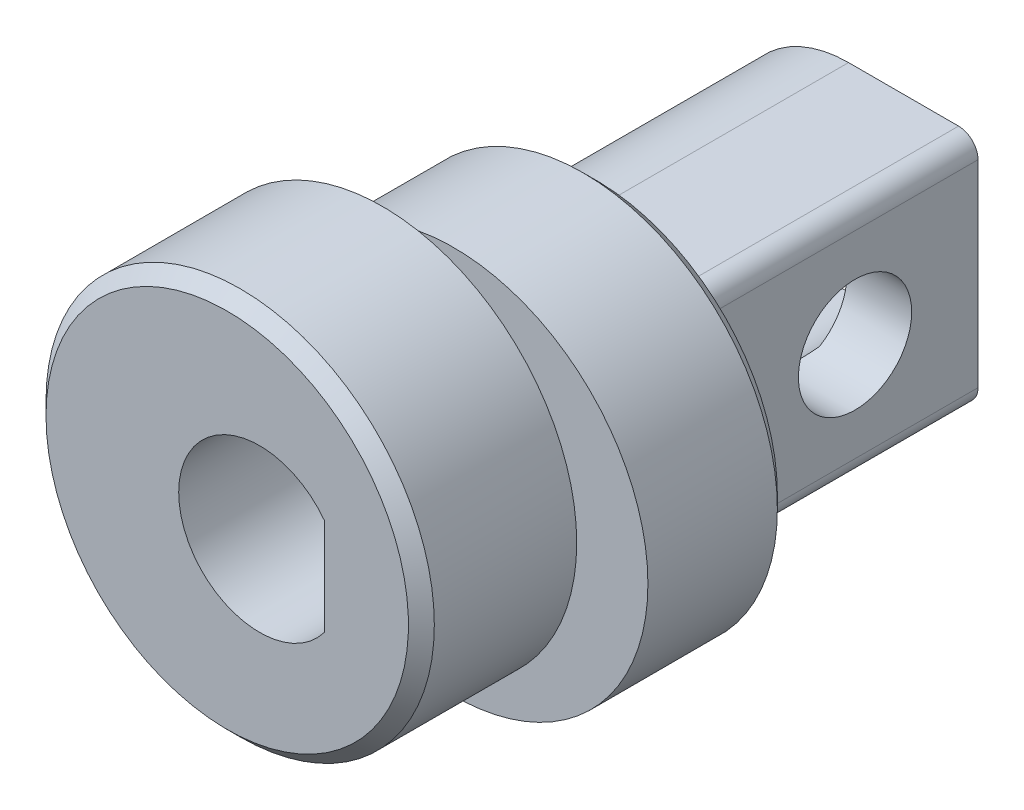
ISO-10303-21;
HEADER;
FILE_DESCRIPTION(('STEP AP214'),'2;1');
FILE_NAME('part.step','',(''),(''),'','','');
FILE_SCHEMA(('AUTOMOTIVE_DESIGN { 1 0 10303 214 1 1 1 1 }'));
ENDSEC;
DATA;
#1=APPLICATION_CONTEXT('core data for automotive mechanical design processes');
#2=APPLICATION_PROTOCOL_DEFINITION('international standard','automotive_design',2000,#1);
#3=PRODUCT_CONTEXT('',#1,'mechanical');
#4=PRODUCT('Part','Part','',(#3));
#5=PRODUCT_RELATED_PRODUCT_CATEGORY('part','',(#4));
#6=PRODUCT_DEFINITION_FORMATION('','',#4);
#7=PRODUCT_DEFINITION_CONTEXT('part definition',#1,'design');
#8=PRODUCT_DEFINITION('design','',#6,#7);
#9=PRODUCT_DEFINITION_SHAPE('','',#8);
#10=(LENGTH_UNIT() NAMED_UNIT(*) SI_UNIT(.MILLI.,.METRE.));
#11=(NAMED_UNIT(*) PLANE_ANGLE_UNIT() SI_UNIT($,.RADIAN.));
#12=(NAMED_UNIT(*) SI_UNIT($,.STERADIAN.) SOLID_ANGLE_UNIT());
#13=UNCERTAINTY_MEASURE_WITH_UNIT(LENGTH_MEASURE(1.E-05),#10,'distance_accuracy_value','');
#14=(GEOMETRIC_REPRESENTATION_CONTEXT(3) GLOBAL_UNCERTAINTY_ASSIGNED_CONTEXT((#13)) GLOBAL_UNIT_ASSIGNED_CONTEXT((#10,
#11,#12)) REPRESENTATION_CONTEXT('',''));
#15=CARTESIAN_POINT('',(0.,0.,0.));
#16=DIRECTION('',(0.,0.,1.));
#17=DIRECTION('',(1.,0.,0.));
#18=AXIS2_PLACEMENT_3D('',#15,#16,#17);
#19=CARTESIAN_POINT('',(2.,-1.5,-8.79999999993873));
#20=DIRECTION('',(1.,0.,0.));
#21=DIRECTION('',(0.,0.,-1.));
#22=AXIS2_PLACEMENT_3D('',#19,#20,#21);
#23=PLANE('',#22);
#24=DIRECTION('',(0.,0.,1.));
#25=VECTOR('',#24,1.);
#26=CARTESIAN_POINT('',(2.,1.5,-8.79999999993873));
#27=LINE('',#26,#25);
#28=CARTESIAN_POINT('',(2.,1.5,-4.09861218113402));
#29=VERTEX_POINT('',#28);
#30=CARTESIAN_POINT('',(2.,1.5,9.4));
#31=VERTEX_POINT('',#30);
#32=EDGE_CURVE('E146',#29,#31,#27,.T.);
#33=ORIENTED_EDGE('',*,*,#32,.F.);
#34=CARTESIAN_POINT('',(2.,0.,-5.));
#35=DIRECTION('',(1.,0.,0.));
#36=DIRECTION('',(0.,0.,-1.));
#37=AXIS2_PLACEMENT_3D('',#34,#35,#36);
#38=CIRCLE('',#37,1.74999999999999);
#39=CARTESIAN_POINT('',(2.,-1.5,-4.09861218113402));
#40=VERTEX_POINT('',#39);
#41=EDGE_CURVE('E59',#29,#40,#38,.T.);
#42=ORIENTED_EDGE('',*,*,#41,.T.);
#43=DIRECTION('',(0.,0.,1.));
#44=VECTOR('',#43,1.);
#45=CARTESIAN_POINT('',(2.,-1.5,-8.79999999993873));
#46=LINE('',#45,#44);
#47=CARTESIAN_POINT('',(2.,-1.5,9.4));
#48=VERTEX_POINT('',#47);
#49=EDGE_CURVE('E154',#40,#48,#46,.T.);
#50=ORIENTED_EDGE('',*,*,#49,.T.);
#51=DIRECTION('',(0.,1.,0.));
#52=VECTOR('',#51,1.);
#53=CARTESIAN_POINT('',(2.,-1.5,9.4));
#54=LINE('',#53,#52);
#55=EDGE_CURVE('E152',#48,#31,#54,.T.);
#56=ORIENTED_EDGE('',*,*,#55,.T.);
#57=EDGE_LOOP('',(#33,#42,#50,#56));
#58=FACE_BOUND('',#57,.T.);
#59=ADVANCED_FACE('F43',(#58),#23,.F.);
#60=CARTESIAN_POINT('',(1.2,0.,0.200000000013279));
#61=DIRECTION('',(0.,0.,1.));
#62=DIRECTION('',(1.,0.,0.));
#63=AXIS2_PLACEMENT_3D('',#60,#61,#62);
#64=PLANE('',#63);
#65=CARTESIAN_POINT('',(1.2,0.,0.200000000013279));
#66=DIRECTION('',(0.,0.,1.));
#67=DIRECTION('',(1.,0.,0.));
#68=AXIS2_PLACEMENT_3D('',#65,#66,#67);
#69=CIRCLE('',#68,5.60000000004356);
#70=CARTESIAN_POINT('',(6.80000000004356,0.,0.200000000013279));
#71=VERTEX_POINT('',#70);
#72=EDGE_CURVE('E317',#71,#71,#69,.F.);
#73=ORIENTED_EDGE('',*,*,#72,.T.);
#74=EDGE_LOOP('',(#73));
#75=FACE_BOUND('',#74,.T.);
#76=CARTESIAN_POINT('',(3.4,3.05,0.200000000013279));
#77=DIRECTION('',(0.,0.,-1.));
#78=DIRECTION('',(1.,0.,0.));
#79=AXIS2_PLACEMENT_3D('',#76,#77,#78);
#80=CIRCLE('',#79,0.6);
#81=CARTESIAN_POINT('',(3.4,3.65,0.200000000013279));
#82=VERTEX_POINT('',#81);
#83=CARTESIAN_POINT('',(4.,3.05,0.200000000013279));
#84=VERTEX_POINT('',#83);
#85=EDGE_CURVE('E157',#82,#84,#80,.T.);
#86=ORIENTED_EDGE('',*,*,#85,.F.);
#87=DIRECTION('',(1.,0.,0.));
#88=VECTOR('',#87,1.);
#89=CARTESIAN_POINT('',(3.4,3.65,0.200000000013279));
#90=LINE('',#89,#88);
#91=CARTESIAN_POINT('',(0.,3.65,0.200000000013279));
#92=VERTEX_POINT('',#91);
#93=EDGE_CURVE('E162',#92,#82,#90,.T.);
#94=ORIENTED_EDGE('',*,*,#93,.F.);
#95=CARTESIAN_POINT('',(0.,0.,0.200000000013279));
#96=DIRECTION('',(0.,0.,-1.));
#97=DIRECTION('',(1.,0.,0.));
#98=AXIS2_PLACEMENT_3D('',#95,#96,#97);
#99=CIRCLE('',#98,3.65);
#100=CARTESIAN_POINT('',(0.,-3.65,0.200000000013279));
#101=VERTEX_POINT('',#100);
#102=EDGE_CURVE('E184',#101,#92,#99,.T.);
#103=ORIENTED_EDGE('',*,*,#102,.F.);
#104=DIRECTION('',(-1.,0.,0.));
#105=VECTOR('',#104,1.);
#106=CARTESIAN_POINT('',(0.,-3.65,0.200000000013279));
#107=LINE('',#106,#105);
#108=CARTESIAN_POINT('',(3.4,-3.65,0.200000000013279));
#109=VERTEX_POINT('',#108);
#110=EDGE_CURVE('E181',#109,#101,#107,.T.);
#111=ORIENTED_EDGE('',*,*,#110,.F.);
#112=CARTESIAN_POINT('',(3.4,-3.05,0.200000000013279));
#113=DIRECTION('',(0.,0.,-1.));
#114=DIRECTION('',(1.,0.,0.));
#115=AXIS2_PLACEMENT_3D('',#112,#113,#114);
#116=CIRCLE('',#115,0.6);
#117=CARTESIAN_POINT('',(4.,-3.05,0.200000000013279));
#118=VERTEX_POINT('',#117);
#119=EDGE_CURVE('E178',#118,#109,#116,.T.);
#120=ORIENTED_EDGE('',*,*,#119,.F.);
#121=DIRECTION('',(0.,-1.,0.));
#122=VECTOR('',#121,1.);
#123=CARTESIAN_POINT('',(4.,-3.05,0.200000000013279));
#124=LINE('',#123,#122);
#125=EDGE_CURVE('E175',#84,#118,#124,.T.);
#126=ORIENTED_EDGE('',*,*,#125,.F.);
#127=EDGE_LOOP('',(#86,#94,#103,#111,#120,#126));
#128=FACE_BOUND('',#127,.T.);
#129=ADVANCED_FACE('F234',(#75,#128),#64,.F.);
#130=CARTESIAN_POINT('',(1.2,0.,0.200000000013279));
#131=DIRECTION('',(0.,0.,1.));
#132=DIRECTION('',(1.,0.,0.));
#133=AXIS2_PLACEMENT_3D('',#130,#131,#132);
#134=CYLINDRICAL_SURFACE('',#133,6.);
#135=CARTESIAN_POINT('',(1.2,0.,0.600000000026554));
#136=DIRECTION('',(0.,0.,1.));
#137=DIRECTION('',(1.,0.,0.));
#138=AXIS2_PLACEMENT_3D('',#135,#136,#137);
#139=CIRCLE('',#138,6.);
#140=CARTESIAN_POINT('',(7.2,0.,0.600000000026554));
#141=VERTEX_POINT('',#140);
#142=EDGE_CURVE('E320',#141,#141,#139,.T.);
#143=ORIENTED_EDGE('',*,*,#142,.T.);
#144=EDGE_LOOP('',(#143));
#145=FACE_BOUND('',#144,.T.);
#146=CARTESIAN_POINT('',(1.2,0.,4.6));
#147=DIRECTION('',(0.,0.,1.));
#148=DIRECTION('',(1.,0.,0.));
#149=AXIS2_PLACEMENT_3D('',#146,#147,#148);
#150=CIRCLE('',#149,6.);
#151=CARTESIAN_POINT('',(0.100000000000005,5.89830484122345,4.6));
#152=VERTEX_POINT('',#151);
#153=CARTESIAN_POINT('',(0.100000000000005,-5.89830484122345,4.6));
#154=VERTEX_POINT('',#153);
#155=EDGE_CURVE('E132',#152,#154,#150,.T.);
#156=ORIENTED_EDGE('',*,*,#155,.F.);
#157=EDGE_CURVE('E206',#154,#152,#150,.T.);
#158=ORIENTED_EDGE('',*,*,#157,.F.);
#159=EDGE_LOOP('',(#156,#158));
#160=FACE_BOUND('',#159,.T.);
#161=ADVANCED_FACE('F241',(#145,#160),#134,.T.);
#162=CARTESIAN_POINT('',(1.2,0.,4.6));
#163=DIRECTION('',(0.,0.,1.));
#164=DIRECTION('',(1.,0.,0.));
#165=AXIS2_PLACEMENT_3D('',#162,#163,#164);
#166=PLANE('',#165);
#167=ORIENTED_EDGE('',*,*,#157,.T.);
#168=CARTESIAN_POINT('',(-1.,0.,4.6));
#169=DIRECTION('',(0.,0.,-1.));
#170=DIRECTION('',(-1.,0.,0.));
#171=AXIS2_PLACEMENT_3D('',#168,#169,#170);
#172=CIRCLE('',#171,6.);
#173=EDGE_CURVE('E148',#152,#154,#172,.T.);
#174=ORIENTED_EDGE('',*,*,#173,.T.);
#175=EDGE_LOOP('',(#167,#174));
#176=FACE_BOUND('',#175,.T.);
#177=ADVANCED_FACE('F298',(#176),#166,.T.);
#178=CARTESIAN_POINT('',(3.4,3.05,-8.79999999993873));
#179=DIRECTION('',(0.,0.,1.));
#180=DIRECTION('',(1.,0.,0.));
#181=AXIS2_PLACEMENT_3D('',#178,#179,#180);
#182=CYLINDRICAL_SURFACE('',#181,0.6);
#183=ORIENTED_EDGE('',*,*,#85,.T.);
#184=DIRECTION('',(0.,0.,1.));
#185=VECTOR('',#184,1.);
#186=CARTESIAN_POINT('',(4.,3.05,-8.79999999993873));
#187=LINE('',#186,#185);
#188=CARTESIAN_POINT('',(4.,3.05,-8.79999999993873));
#189=VERTEX_POINT('',#188);
#190=EDGE_CURVE('E203',#189,#84,#187,.T.);
#191=ORIENTED_EDGE('',*,*,#190,.F.);
#192=CARTESIAN_POINT('',(3.4,3.05,-8.79999999993873));
#193=DIRECTION('',(0.,0.,-1.));
#194=DIRECTION('',(1.,0.,0.));
#195=AXIS2_PLACEMENT_3D('',#192,#193,#194);
#196=CIRCLE('',#195,0.6);
#197=CARTESIAN_POINT('',(3.4,3.65,-8.79999999993873));
#198=VERTEX_POINT('',#197);
#199=EDGE_CURVE('E158',#198,#189,#196,.T.);
#200=ORIENTED_EDGE('',*,*,#199,.F.);
#201=DIRECTION('',(0.,0.,1.));
#202=VECTOR('',#201,1.);
#203=CARTESIAN_POINT('',(3.4,3.65,-8.79999999993873));
#204=LINE('',#203,#202);
#205=EDGE_CURVE('E172',#198,#82,#204,.T.);
#206=ORIENTED_EDGE('',*,*,#205,.T.);
#207=EDGE_LOOP('',(#183,#191,#200,#206));
#208=FACE_BOUND('',#207,.T.);
#209=ADVANCED_FACE('F262',(#208),#182,.T.);
#210=CARTESIAN_POINT('',(4.,-3.05,-8.79999999993873));
#211=DIRECTION('',(-1.,0.,0.));
#212=DIRECTION('',(0.,0.,1.));
#213=AXIS2_PLACEMENT_3D('',#210,#211,#212);
#214=PLANE('',#213);
#215=CARTESIAN_POINT('',(4.,0.,-5.));
#216=DIRECTION('',(1.,0.,0.));
#217=DIRECTION('',(0.,0.,-1.));
#218=AXIS2_PLACEMENT_3D('',#215,#216,#217);
#219=CIRCLE('',#218,1.74999999999999);
#220=CARTESIAN_POINT('',(4.,0.,-6.74999999999999));
#221=VERTEX_POINT('',#220);
#222=EDGE_CURVE('E141',#221,#221,#219,.T.);
#223=ORIENTED_EDGE('',*,*,#222,.F.);
#224=EDGE_LOOP('',(#223));
#225=FACE_BOUND('',#224,.T.);
#226=ORIENTED_EDGE('',*,*,#125,.T.);
#227=DIRECTION('',(0.,0.,1.));
#228=VECTOR('',#227,1.);
#229=CARTESIAN_POINT('',(4.,-3.05,-8.79999999993873));
#230=LINE('',#229,#228);
#231=CARTESIAN_POINT('',(4.,-3.05,-8.79999999993873));
#232=VERTEX_POINT('',#231);
#233=EDGE_CURVE('E200',#232,#118,#230,.T.);
#234=ORIENTED_EDGE('',*,*,#233,.F.);
#235=DIRECTION('',(0.,-1.,0.));
#236=VECTOR('',#235,1.);
#237=CARTESIAN_POINT('',(4.,-3.05,-8.79999999993873));
#238=LINE('',#237,#236);
#239=EDGE_CURVE('E161',#189,#232,#238,.T.);
#240=ORIENTED_EDGE('',*,*,#239,.F.);
#241=ORIENTED_EDGE('',*,*,#190,.T.);
#242=EDGE_LOOP('',(#226,#234,#240,#241));
#243=FACE_BOUND('',#242,.T.);
#244=ADVANCED_FACE('F259',(#225,#243),#214,.F.);
#245=CARTESIAN_POINT('',(3.4,-3.05,-8.79999999993873));
#246=DIRECTION('',(0.,0.,1.));
#247=DIRECTION('',(1.,0.,0.));
#248=AXIS2_PLACEMENT_3D('',#245,#246,#247);
#249=CYLINDRICAL_SURFACE('',#248,0.6);
#250=ORIENTED_EDGE('',*,*,#119,.T.);
#251=DIRECTION('',(0.,0.,1.));
#252=VECTOR('',#251,1.);
#253=CARTESIAN_POINT('',(3.4,-3.65,-8.79999999993873));
#254=LINE('',#253,#252);
#255=CARTESIAN_POINT('',(3.4,-3.65,-8.79999999993873));
#256=VERTEX_POINT('',#255);
#257=EDGE_CURVE('E197',#256,#109,#254,.T.);
#258=ORIENTED_EDGE('',*,*,#257,.F.);
#259=CARTESIAN_POINT('',(3.4,-3.05,-8.79999999993873));
#260=DIRECTION('',(0.,0.,-1.));
#261=DIRECTION('',(1.,0.,0.));
#262=AXIS2_PLACEMENT_3D('',#259,#260,#261);
#263=CIRCLE('',#262,0.6);
#264=EDGE_CURVE('E164',#232,#256,#263,.T.);
#265=ORIENTED_EDGE('',*,*,#264,.F.);
#266=ORIENTED_EDGE('',*,*,#233,.T.);
#267=EDGE_LOOP('',(#250,#258,#265,#266));
#268=FACE_BOUND('',#267,.T.);
#269=ADVANCED_FACE('F261',(#268),#249,.T.);
#270=CARTESIAN_POINT('',(0.,-3.65,-8.79999999993873));
#271=DIRECTION('',(0.,1.,0.));
#272=DIRECTION('',(-1.,0.,0.));
#273=AXIS2_PLACEMENT_3D('',#270,#271,#272);
#274=PLANE('',#273);
#275=ORIENTED_EDGE('',*,*,#110,.T.);
#276=DIRECTION('',(0.,0.,1.));
#277=VECTOR('',#276,1.);
#278=CARTESIAN_POINT('',(0.,-3.65,-8.79999999993873));
#279=LINE('',#278,#277);
#280=CARTESIAN_POINT('',(0.,-3.65,-8.79999999993873));
#281=VERTEX_POINT('',#280);
#282=EDGE_CURVE('E194',#281,#101,#279,.T.);
#283=ORIENTED_EDGE('',*,*,#282,.F.);
#284=DIRECTION('',(-1.,0.,0.));
#285=VECTOR('',#284,1.);
#286=CARTESIAN_POINT('',(0.,-3.65,-8.79999999993873));
#287=LINE('',#286,#285);
#288=EDGE_CURVE('E166',#256,#281,#287,.T.);
#289=ORIENTED_EDGE('',*,*,#288,.F.);
#290=ORIENTED_EDGE('',*,*,#257,.T.);
#291=EDGE_LOOP('',(#275,#283,#289,#290));
#292=FACE_BOUND('',#291,.T.);
#293=ADVANCED_FACE('F285',(#292),#274,.F.);
#294=CARTESIAN_POINT('',(0.,0.,-8.79999999993873));
#295=DIRECTION('',(0.,0.,1.));
#296=DIRECTION('',(1.,0.,0.));
#297=AXIS2_PLACEMENT_3D('',#294,#295,#296);
#298=CYLINDRICAL_SURFACE('',#297,3.65);
#299=ORIENTED_EDGE('',*,*,#102,.T.);
#300=DIRECTION('',(0.,0.,1.));
#301=VECTOR('',#300,1.);
#302=CARTESIAN_POINT('',(0.,3.65,-8.79999999993873));
#303=LINE('',#302,#301);
#304=CARTESIAN_POINT('',(0.,3.65,-8.79999999993873));
#305=VERTEX_POINT('',#304);
#306=EDGE_CURVE('E191',#305,#92,#303,.T.);
#307=ORIENTED_EDGE('',*,*,#306,.F.);
#308=CARTESIAN_POINT('',(0.,0.,-8.79999999993873));
#309=DIRECTION('',(0.,0.,-1.));
#310=DIRECTION('',(1.,0.,0.));
#311=AXIS2_PLACEMENT_3D('',#308,#309,#310);
#312=CIRCLE('',#311,3.65);
#313=EDGE_CURVE('E168',#281,#305,#312,.T.);
#314=ORIENTED_EDGE('',*,*,#313,.F.);
#315=ORIENTED_EDGE('',*,*,#282,.T.);
#316=EDGE_LOOP('',(#299,#307,#314,#315));
#317=FACE_BOUND('',#316,.T.);
#318=ADVANCED_FACE('F283',(#317),#298,.T.);
#319=CARTESIAN_POINT('',(3.4,3.65,-8.79999999993873));
#320=DIRECTION('',(0.,-1.,0.));
#321=DIRECTION('',(0.,0.,-1.));
#322=AXIS2_PLACEMENT_3D('',#319,#320,#321);
#323=PLANE('',#322);
#324=ORIENTED_EDGE('',*,*,#93,.T.);
#325=ORIENTED_EDGE('',*,*,#205,.F.);
#326=DIRECTION('',(1.,0.,0.));
#327=VECTOR('',#326,1.);
#328=CARTESIAN_POINT('',(3.4,3.65,-8.79999999993873));
#329=LINE('',#328,#327);
#330=EDGE_CURVE('E170',#305,#198,#329,.T.);
#331=ORIENTED_EDGE('',*,*,#330,.F.);
#332=ORIENTED_EDGE('',*,*,#306,.T.);
#333=EDGE_LOOP('',(#324,#325,#331,#332));
#334=FACE_BOUND('',#333,.T.);
#335=ADVANCED_FACE('F279',(#334),#323,.F.);
#336=CARTESIAN_POINT('',(3.4,3.05,-8.79999999993873));
#337=DIRECTION('',(0.,0.,1.));
#338=DIRECTION('',(1.,0.,0.));
#339=AXIS2_PLACEMENT_3D('',#336,#337,#338);
#340=PLANE('',#339);
#341=DIRECTION('',(0.,1.,0.));
#342=VECTOR('',#341,1.);
#343=CARTESIAN_POINT('',(2.,-1.5,-8.79999999993873));
#344=LINE('',#343,#342);
#345=CARTESIAN_POINT('',(2.,-1.5,-8.79999999993873));
#346=VERTEX_POINT('',#345);
#347=CARTESIAN_POINT('',(2.,1.5,-8.79999999993873));
#348=VERTEX_POINT('',#347);
#349=EDGE_CURVE('E251',#346,#348,#344,.T.);
#350=ORIENTED_EDGE('',*,*,#349,.T.);
#351=CARTESIAN_POINT('',(0.,0.,-8.79999999993873));
#352=DIRECTION('',(0.,0.,1.));
#353=DIRECTION('',(1.,0.,0.));
#354=AXIS2_PLACEMENT_3D('',#351,#352,#353);
#355=CIRCLE('',#354,2.5);
#356=EDGE_CURVE('E67',#348,#346,#355,.T.);
#357=ORIENTED_EDGE('',*,*,#356,.T.);
#358=EDGE_LOOP('',(#350,#357));
#359=FACE_BOUND('',#358,.T.);
#360=ORIENTED_EDGE('',*,*,#199,.T.);
#361=ORIENTED_EDGE('',*,*,#239,.T.);
#362=ORIENTED_EDGE('',*,*,#264,.T.);
#363=ORIENTED_EDGE('',*,*,#288,.T.);
#364=ORIENTED_EDGE('',*,*,#313,.T.);
#365=ORIENTED_EDGE('',*,*,#330,.T.);
#366=EDGE_LOOP('',(#360,#361,#362,#363,#364,#365));
#367=FACE_BOUND('',#366,.T.);
#368=ADVANCED_FACE('F272',(#359,#367),#340,.F.);
#369=CARTESIAN_POINT('',(-1.,0.,9.4));
#370=DIRECTION('',(0.,0.,-1.));
#371=DIRECTION('',(-1.,0.,0.));
#372=AXIS2_PLACEMENT_3D('',#369,#370,#371);
#373=CYLINDRICAL_SURFACE('',#372,6.);
#374=CARTESIAN_POINT('',(-1.,0.,8.99999999998673));
#375=DIRECTION('',(0.,0.,-1.));
#376=DIRECTION('',(-1.,0.,0.));
#377=AXIS2_PLACEMENT_3D('',#374,#375,#376);
#378=CIRCLE('',#377,6.);
#379=CARTESIAN_POINT('',(-7.,0.,8.99999999998673));
#380=VERTEX_POINT('',#379);
#381=EDGE_CURVE('E52',#380,#380,#378,.T.);
#382=ORIENTED_EDGE('',*,*,#381,.T.);
#383=EDGE_LOOP('',(#382));
#384=FACE_BOUND('',#383,.T.);
#385=ORIENTED_EDGE('',*,*,#173,.F.);
#386=EDGE_CURVE('E145',#154,#152,#172,.T.);
#387=ORIENTED_EDGE('',*,*,#386,.F.);
#388=EDGE_LOOP('',(#385,#387));
#389=FACE_BOUND('',#388,.T.);
#390=ADVANCED_FACE('F325',(#384,#389),#373,.T.);
#391=CARTESIAN_POINT('',(-1.,0.,9.4));
#392=DIRECTION('',(0.,0.,-1.));
#393=DIRECTION('',(-1.,0.,0.));
#394=AXIS2_PLACEMENT_3D('',#391,#392,#393);
#395=PLANE('',#394);
#396=CARTESIAN_POINT('',(-1.,0.,9.4));
#397=DIRECTION('',(0.,0.,-1.));
#398=DIRECTION('',(-1.,0.,0.));
#399=AXIS2_PLACEMENT_3D('',#396,#397,#398);
#400=CIRCLE('',#399,5.60000000004357);
#401=CARTESIAN_POINT('',(-6.60000000004357,0.,9.4));
#402=VERTEX_POINT('',#401);
#403=EDGE_CURVE('E11',#402,#402,#400,.F.);
#404=ORIENTED_EDGE('',*,*,#403,.T.);
#405=EDGE_LOOP('',(#404));
#406=FACE_BOUND('',#405,.T.);
#407=ORIENTED_EDGE('',*,*,#55,.F.);
#408=CARTESIAN_POINT('',(0.,0.,9.4));
#409=DIRECTION('',(0.,0.,1.));
#410=DIRECTION('',(1.,0.,0.));
#411=AXIS2_PLACEMENT_3D('',#408,#409,#410);
#412=CIRCLE('',#411,2.5);
#413=EDGE_CURVE('E248',#31,#48,#412,.T.);
#414=ORIENTED_EDGE('',*,*,#413,.F.);
#415=EDGE_LOOP('',(#407,#414));
#416=FACE_BOUND('',#415,.T.);
#417=ADVANCED_FACE('F250',(#406,#416),#395,.F.);
#418=CARTESIAN_POINT('',(-1.,0.,4.6));
#419=DIRECTION('',(0.,0.,-1.));
#420=DIRECTION('',(-1.,0.,0.));
#421=AXIS2_PLACEMENT_3D('',#418,#419,#420);
#422=PLANE('',#421);
#423=ORIENTED_EDGE('',*,*,#386,.T.);
#424=ORIENTED_EDGE('',*,*,#155,.T.);
#425=EDGE_LOOP('',(#423,#424));
#426=FACE_BOUND('',#425,.T.);
#427=ADVANCED_FACE('F232',(#426),#422,.T.);
#428=CARTESIAN_POINT('',(0.,0.,-8.79999999993873));
#429=DIRECTION('',(0.,0.,1.));
#430=DIRECTION('',(1.,0.,0.));
#431=AXIS2_PLACEMENT_3D('',#428,#429,#430);
#432=CYLINDRICAL_SURFACE('',#431,2.5);
#433=ORIENTED_EDGE('',*,*,#49,.F.);
#434=CARTESIAN_POINT('',(2.,-1.5,-4.09861218113402));
#435=CARTESIAN_POINT('',(1.96919693676125,-1.54111506463078,-4.16704609545675));
#436=CARTESIAN_POINT('',(1.9395516254312,-1.5779439990415,-4.23894035325243));
#437=CARTESIAN_POINT('',(1.88544278440642,-1.6422139841659,-4.38971580683063));
#438=CARTESIAN_POINT('',(1.8610456040167,-1.66953725295177,-4.46867040289528));
#439=CARTESIAN_POINT('',(1.8210270314064,-1.71311578005956,-4.63263139476398));
#440=CARTESIAN_POINT('',(1.8054802045946,-1.72927723431148,-4.71768260489365));
#441=CARTESIAN_POINT('',(1.78671296540577,-1.74867444545503,-4.89007658765763));
#442=CARTESIAN_POINT('',(1.78340621347269,-1.75200074659436,-4.97739891664062));
#443=CARTESIAN_POINT('',(1.78915004586714,-1.74612012012797,-5.13797902342276));
#444=CARTESIAN_POINT('',(1.79642102208272,-1.73871875077734,-5.2113812941522));
#445=CARTESIAN_POINT('',(1.8190602025978,-1.71501770059205,-5.35580888232998));
#446=CARTESIAN_POINT('',(1.83447215934298,-1.69866992138504,-5.42681912910629));
#447=CARTESIAN_POINT('',(1.87240713346815,-1.6567804074307,-5.56865644187989));
#448=CARTESIAN_POINT('',(1.89528397882376,-1.63076968730701,-5.63924455706428));
#449=CARTESIAN_POINT('',(1.94514685227837,-1.57096277825587,-5.77458360518461));
#450=CARTESIAN_POINT('',(1.97208893663922,-1.53724807103234,-5.83938639648569));
#451=CARTESIAN_POINT('',(2.,-1.5,-5.90138781886599));
#452=B_SPLINE_CURVE_WITH_KNOTS('',3,(#434,#435,#436,#437,#438,#439,#440,#441,#442,#443,#444,
#445,#446,#447,#448,#449,#450,#451),.UNSPECIFIED.,.F.,.F.,(4,2,2,2,2,2,2,2,4),(0.,
0.256989676870287,0.517058825168968,0.779287840399347,1.03966356984459,1.26097355616433,
1.48348522483027,1.7186207147886,1.95137581640571),.UNSPECIFIED.);
#453=CARTESIAN_POINT('',(2.,-1.5,-5.90138781886598));
#454=VERTEX_POINT('',#453);
#455=EDGE_CURVE('E131',#40,#454,#452,.T.);
#456=ORIENTED_EDGE('',*,*,#455,.T.);
#457=EDGE_CURVE('E140',#346,#454,#46,.T.);
#458=ORIENTED_EDGE('',*,*,#457,.F.);
#459=ORIENTED_EDGE('',*,*,#356,.F.);
#460=CARTESIAN_POINT('',(2.,1.5,-5.90138781886598));
#461=VERTEX_POINT('',#460);
#462=EDGE_CURVE('E138',#348,#461,#27,.T.);
#463=ORIENTED_EDGE('',*,*,#462,.T.);
#464=CARTESIAN_POINT('',(2.,1.5,-5.90138781886598));
#465=CARTESIAN_POINT('',(1.96919693676125,1.54111506463078,-5.83295390454325));
#466=CARTESIAN_POINT('',(1.9395516254312,1.5779439990415,-5.76105964674757));
#467=CARTESIAN_POINT('',(1.88544278440642,1.6422139841659,-5.61028419316937));
#468=CARTESIAN_POINT('',(1.8610456040167,1.66953725295177,-5.53132959710472));
#469=CARTESIAN_POINT('',(1.8210270314064,1.71311578005956,-5.36736860523602));
#470=CARTESIAN_POINT('',(1.8054802045946,1.72927723431148,-5.28231739510635));
#471=CARTESIAN_POINT('',(1.78671296540577,1.74867444545503,-5.10992341234237));
#472=CARTESIAN_POINT('',(1.78340621347269,1.75200074659436,-5.02260108335938));
#473=CARTESIAN_POINT('',(1.78915004586714,1.74612012012797,-4.86202097657724));
#474=CARTESIAN_POINT('',(1.79642102208272,1.73871875077734,-4.7886187058478));
#475=CARTESIAN_POINT('',(1.8190602025978,1.71501770059205,-4.64419111767002));
#476=CARTESIAN_POINT('',(1.83447215934298,1.69866992138504,-4.57318087089371));
#477=CARTESIAN_POINT('',(1.87240713346815,1.6567804074307,-4.43134355812011));
#478=CARTESIAN_POINT('',(1.89528397882376,1.63076968730701,-4.36075544293572));
#479=CARTESIAN_POINT('',(1.94514685227837,1.57096277825587,-4.22541639481539));
#480=CARTESIAN_POINT('',(1.97208893663922,1.53724807103234,-4.16061360351431));
#481=CARTESIAN_POINT('',(2.,1.5,-4.09861218113402));
#482=B_SPLINE_CURVE_WITH_KNOTS('',3,(#464,#465,#466,#467,#468,#469,#470,#471,#472,#473,#474,
#475,#476,#477,#478,#479,#480,#481),.UNSPECIFIED.,.F.,.F.,(4,2,2,2,2,2,2,2,4),(0.,
0.256989676870286,0.517058825168968,0.779287840399347,1.03966356984458,1.26097355616433,
1.48348522483027,1.71862071478859,1.95137581640571),.UNSPECIFIED.);
#483=EDGE_CURVE('E125',#461,#29,#482,.T.);
#484=ORIENTED_EDGE('',*,*,#483,.T.);
#485=ORIENTED_EDGE('',*,*,#32,.T.);
#486=ORIENTED_EDGE('',*,*,#413,.T.);
#487=EDGE_LOOP('',(#433,#456,#458,#459,#463,#484,#485,#486));
#488=FACE_BOUND('',#487,.T.);
#489=ADVANCED_FACE('F144',(#488),#432,.F.);
#490=ORIENTED_EDGE('',*,*,#457,.T.);
#491=EDGE_CURVE('E128',#454,#461,#38,.T.);
#492=ORIENTED_EDGE('',*,*,#491,.T.);
#493=ORIENTED_EDGE('',*,*,#462,.F.);
#494=ORIENTED_EDGE('',*,*,#349,.F.);
#495=EDGE_LOOP('',(#490,#492,#493,#494));
#496=FACE_BOUND('',#495,.T.);
#497=ADVANCED_FACE('F136',(#496),#23,.F.);
#498=CARTESIAN_POINT('',(4.,0.,-5.));
#499=DIRECTION('',(1.,0.,0.));
#500=DIRECTION('',(0.,0.,-1.));
#501=AXIS2_PLACEMENT_3D('',#498,#499,#500);
#502=CYLINDRICAL_SURFACE('',#501,1.74999999999999);
#503=ORIENTED_EDGE('',*,*,#222,.T.);
#504=EDGE_LOOP('',(#503));
#505=FACE_BOUND('',#504,.T.);
#506=ORIENTED_EDGE('',*,*,#41,.F.);
#507=ORIENTED_EDGE('',*,*,#483,.F.);
#508=ORIENTED_EDGE('',*,*,#491,.F.);
#509=ORIENTED_EDGE('',*,*,#455,.F.);
#510=EDGE_LOOP('',(#506,#507,#508,#509));
#511=FACE_BOUND('',#510,.T.);
#512=ADVANCED_FACE('F127',(#505,#511),#502,.F.);
#513=CARTESIAN_POINT('',(1.2,0.,0.600000000026554));
#514=DIRECTION('',(0.,0.,1.));
#515=DIRECTION('',(1.,0.,0.));
#516=AXIS2_PLACEMENT_3D('',#513,#514,#515);
#517=CONICAL_SURFACE('',#516,6.,0.785398163326399);
#518=ORIENTED_EDGE('',*,*,#72,.F.);
#519=EDGE_LOOP('',(#518));
#520=FACE_BOUND('',#519,.T.);
#521=ORIENTED_EDGE('',*,*,#142,.F.);
#522=EDGE_LOOP('',(#521));
#523=FACE_BOUND('',#522,.T.);
#524=ADVANCED_FACE('F225',(#520,#523),#517,.T.);
#525=CARTESIAN_POINT('',(-1.,0.,8.99999999998673));
#526=DIRECTION('',(0.,0.,-1.));
#527=DIRECTION('',(-1.,0.,0.));
#528=AXIS2_PLACEMENT_3D('',#525,#526,#527);
#529=CONICAL_SURFACE('',#528,6.,0.7853981633264);
#530=CARTESIAN_POINT('',(-6.60000000004357,0.,9.4));
#531=CARTESIAN_POINT('',(-6.60416666670978,0.,9.3958333333332));
#532=CARTESIAN_POINT('',(-6.60833333337599,0.,9.39166666666639));
#533=CARTESIAN_POINT('',(-6.61666666670842,0.,9.38333333333278));
#534=CARTESIAN_POINT('',(-6.62083333337463,0.,9.37916666666598));
#535=CARTESIAN_POINT('',(-6.62916666670706,0.,9.37083333333237));
#536=CARTESIAN_POINT('',(-6.63333333337327,0.,9.36666666666556));
#537=CARTESIAN_POINT('',(-6.6416666667057,0.,9.35833333333195));
#538=CARTESIAN_POINT('',(-6.64583333337191,0.,9.35416666666515));
#539=CARTESIAN_POINT('',(-6.65416666670433,0.,9.34583333333154));
#540=CARTESIAN_POINT('',(-6.65833333337055,0.,9.34166666666473));
#541=CARTESIAN_POINT('',(-6.66666666670297,0.,9.33333333333112));
#542=CARTESIAN_POINT('',(-6.67083333336919,0.,9.32916666666432));
#543=CARTESIAN_POINT('',(-6.67916666670161,0.,9.32083333333071));
#544=CARTESIAN_POINT('',(-6.68333333336782,0.,9.3166666666639));
#545=CARTESIAN_POINT('',(-6.69166666670025,0.,9.30833333333029));
#546=CARTESIAN_POINT('',(-6.69583333336646,0.,9.30416666666349));
#547=CARTESIAN_POINT('',(-6.70416666669889,0.,9.29583333332988));
#548=CARTESIAN_POINT('',(-6.7083333333651,0.,9.29166666666307));
#549=CARTESIAN_POINT('',(-6.71666666669753,0.,9.28333333332946));
#550=CARTESIAN_POINT('',(-6.72083333336374,0.,9.27916666666266));
#551=CARTESIAN_POINT('',(-6.72916666669617,0.,9.27083333332905));
#552=CARTESIAN_POINT('',(-6.73333333336238,0.,9.26666666666224));
#553=CARTESIAN_POINT('',(-6.7416666666948,0.,9.25833333332863));
#554=CARTESIAN_POINT('',(-6.74583333336102,0.,9.25416666666183));
#555=CARTESIAN_POINT('',(-6.75416666669344,0.,9.24583333332822));
#556=CARTESIAN_POINT('',(-6.75833333335966,0.,9.24166666666141));
#557=CARTESIAN_POINT('',(-6.76666666669208,0.,9.2333333333278));
#558=CARTESIAN_POINT('',(-6.77083333335829,0.,9.229166666661));
#559=CARTESIAN_POINT('',(-6.77916666669072,0.,9.22083333332739));
#560=CARTESIAN_POINT('',(-6.78333333335693,0.,9.21666666666058));
#561=CARTESIAN_POINT('',(-6.79166666668936,0.,9.20833333332697));
#562=CARTESIAN_POINT('',(-6.79583333335557,0.,9.20416666666017));
#563=CARTESIAN_POINT('',(-6.804166666688,0.,9.19583333332656));
#564=CARTESIAN_POINT('',(-6.80833333335421,0.,9.19166666665975));
#565=CARTESIAN_POINT('',(-6.81666666668663,0.,9.18333333332614));
#566=CARTESIAN_POINT('',(-6.82083333335285,0.,9.17916666665934));
#567=CARTESIAN_POINT('',(-6.82916666668527,0.,9.17083333332573));
#568=CARTESIAN_POINT('',(-6.83333333335149,0.,9.16666666665892));
#569=CARTESIAN_POINT('',(-6.84166666668391,0.,9.15833333332531));
#570=CARTESIAN_POINT('',(-6.84583333335013,0.,9.15416666665851));
#571=CARTESIAN_POINT('',(-6.85416666668255,0.,9.1458333333249));
#572=CARTESIAN_POINT('',(-6.85833333334876,0.,9.14166666665809));
#573=CARTESIAN_POINT('',(-6.86666666668119,0.,9.13333333332448));
#574=CARTESIAN_POINT('',(-6.8708333333474,0.,9.12916666665768));
#575=CARTESIAN_POINT('',(-6.87916666667983,0.,9.12083333332407));
#576=CARTESIAN_POINT('',(-6.88333333334604,0.,9.11666666665726));
#577=CARTESIAN_POINT('',(-6.89166666667847,0.,9.10833333332365));
#578=CARTESIAN_POINT('',(-6.89583333334468,0.,9.10416666665685));
#579=CARTESIAN_POINT('',(-6.9041666666771,0.,9.09583333332324));
#580=CARTESIAN_POINT('',(-6.90833333334332,0.,9.09166666665644));
#581=CARTESIAN_POINT('',(-6.91666666667574,0.,9.08333333332283));
#582=CARTESIAN_POINT('',(-6.92083333334196,0.,9.07916666665602));
#583=CARTESIAN_POINT('',(-6.92916666667438,0.,9.07083333332241));
#584=CARTESIAN_POINT('',(-6.93333333334059,0.,9.06666666665561));
#585=CARTESIAN_POINT('',(-6.94166666667302,0.,9.058333333322));
#586=CARTESIAN_POINT('',(-6.94583333333923,0.,9.05416666665519));
#587=CARTESIAN_POINT('',(-6.95416666667166,0.,9.04583333332158));
#588=CARTESIAN_POINT('',(-6.95833333333787,0.,9.04166666665478));
#589=CARTESIAN_POINT('',(-6.9666666666703,0.,9.03333333332117));
#590=CARTESIAN_POINT('',(-6.97083333333651,0.,9.02916666665436));
#591=CARTESIAN_POINT('',(-6.97916666666894,0.,9.02083333332075));
#592=CARTESIAN_POINT('',(-6.98333333333515,0.,9.01666666665395));
#593=CARTESIAN_POINT('',(-6.99166666666757,0.,9.00833333332034));
#594=CARTESIAN_POINT('',(-6.99583333333379,0.,9.00416666665353));
#595=CARTESIAN_POINT('',(-7.,0.,8.99999999998673));
#596=B_SPLINE_CURVE_WITH_KNOTS('',3,(#530,#531,#532,#533,#534,#535,#536,#537,#538,#539,#540,
#541,#542,#543,#544,#545,#546,#547,#548,#549,#550,#551,#552,#553,#554,#555,#556,#557,#558,#559,
#560,#561,#562,#563,#564,#565,#566,#567,#568,#569,#570,#571,#572,#573,#574,#575,#576,#577,#578,
#579,#580,#581,#582,#583,#584,#585,#586,#587,#588,#589,#590,#591,#592,#593,#594,#595),
.UNSPECIFIED.,.F.,.F.,(4,2,2,2,2,2,2,2,2,2,2,2,2,2,2,2,2,2,2,2,2,2,2,2,2,2,2,2,2,2,2,2,4),(0.,
0.0176776695289945,0.0353553390579889,0.0530330085869834,0.0707106781159772,0.0883883476449716,
0.106066017173966,0.123743686702961,0.141421356231954,0.159099025760948,0.176776695289943,
0.194454364818937,0.212132034347932,0.229809703876926,0.247487373405921,0.265165042934915,
0.282842712463908,0.300520381992902,0.318198051521896,0.335875721050891,0.353553390579885,
0.37123106010888,0.388908729637874,0.406586399166869,0.424264068695863,0.441941738224856,
0.459619407753851,0.477297077282845,0.494974746811839,0.512652416340833,0.530330085869828,
0.548007755398822,0.565685424927817),.UNSPECIFIED.);
#597=EDGE_CURVE('BSEAM46',#402,#380,#596,.T.);
#598=ORIENTED_EDGE('',*,*,#403,.F.);
#599=ORIENTED_EDGE('',*,*,#381,.F.);
#600=ORIENTED_EDGE('',*,*,#597,.T.);
#601=ORIENTED_EDGE('',*,*,#597,.F.);
#602=EDGE_LOOP('',(#598,#600,#599,#601));
#603=FACE_BOUND('',#602,.T.);
#604=ADVANCED_FACE('F46',(#603),#529,.T.);
#605=CLOSED_SHELL('',(#59,#129,#161,#177,#209,#244,#269,#293,#318,#335,#368,#390,#417,#427,#489,
#497,#512,#524,#604));
#606=MANIFOLD_SOLID_BREP('B2',#605);
#607=ADVANCED_BREP_SHAPE_REPRESENTATION('',(#18,#606),#14);
#608=SHAPE_DEFINITION_REPRESENTATION(#9,#607);
ENDSEC;
END-ISO-10303-21;
